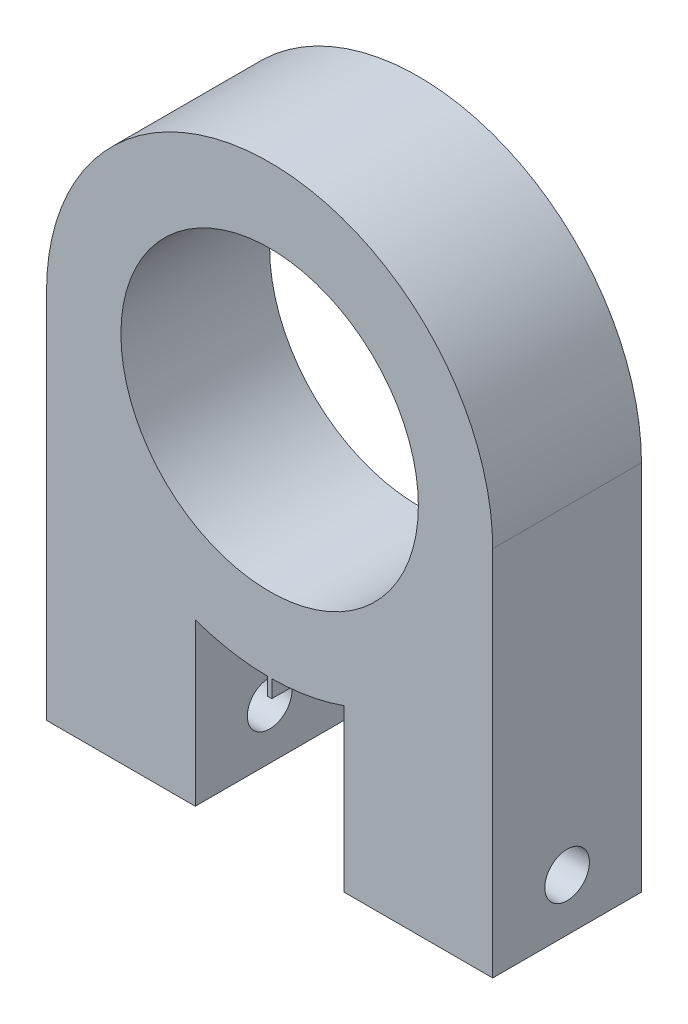
ISO-10303-21;
HEADER;
FILE_DESCRIPTION(('STEP AP214'),'2;1');
FILE_NAME('part.step','',(''),(''),'','','');
FILE_SCHEMA(('AUTOMOTIVE_DESIGN { 1 0 10303 214 1 1 1 1 }'));
ENDSEC;
DATA;
#1=APPLICATION_CONTEXT('core data for automotive mechanical design processes');
#2=APPLICATION_PROTOCOL_DEFINITION('international standard','automotive_design',2000,#1);
#3=PRODUCT_CONTEXT('',#1,'mechanical');
#4=PRODUCT('Part','Part','',(#3));
#5=PRODUCT_RELATED_PRODUCT_CATEGORY('part','',(#4));
#6=PRODUCT_DEFINITION_FORMATION('','',#4);
#7=PRODUCT_DEFINITION_CONTEXT('part definition',#1,'design');
#8=PRODUCT_DEFINITION('design','',#6,#7);
#9=PRODUCT_DEFINITION_SHAPE('','',#8);
#10=(LENGTH_UNIT() NAMED_UNIT(*) SI_UNIT(.MILLI.,.METRE.));
#11=(NAMED_UNIT(*) PLANE_ANGLE_UNIT() SI_UNIT($,.RADIAN.));
#12=(NAMED_UNIT(*) SI_UNIT($,.STERADIAN.) SOLID_ANGLE_UNIT());
#13=UNCERTAINTY_MEASURE_WITH_UNIT(LENGTH_MEASURE(1.E-05),#10,'distance_accuracy_value','');
#14=(GEOMETRIC_REPRESENTATION_CONTEXT(3) GLOBAL_UNCERTAINTY_ASSIGNED_CONTEXT((#13)) GLOBAL_UNIT_ASSIGNED_CONTEXT((#10,
#11,#12)) REPRESENTATION_CONTEXT('',''));
#15=CARTESIAN_POINT('',(0.,0.,0.));
#16=DIRECTION('',(0.,0.,1.));
#17=DIRECTION('',(1.,0.,0.));
#18=AXIS2_PLACEMENT_3D('',#15,#16,#17);
#19=CARTESIAN_POINT('',(0.,0.,10.));
#20=DIRECTION('',(0.,0.,-1.));
#21=DIRECTION('',(-1.,0.,0.));
#22=AXIS2_PLACEMENT_3D('',#19,#20,#21);
#23=CYLINDRICAL_SURFACE('',#22,15.);
#24=CARTESIAN_POINT('',(0.,0.,10.));
#25=DIRECTION('',(0.,0.,1.));
#26=DIRECTION('',(1.,0.,0.));
#27=AXIS2_PLACEMENT_3D('',#24,#25,#26);
#28=CIRCLE('',#27,15.);
#29=CARTESIAN_POINT('',(0.142379023529695,-14.9993242585677,10.));
#30=VERTEX_POINT('',#29);
#31=CARTESIAN_POINT('',(5.00000000000001,-14.1421356237309,10.));
#32=VERTEX_POINT('',#31);
#33=EDGE_CURVE('E253',#30,#32,#28,.T.);
#34=ORIENTED_EDGE('',*,*,#33,.F.);
#35=DIRECTION('',(0.,0.,-1.));
#36=VECTOR('',#35,1.);
#37=CARTESIAN_POINT('',(0.142379023529695,-14.9993242585677,10.));
#38=LINE('',#37,#36);
#39=CARTESIAN_POINT('',(0.142379023529695,-14.9993242585677,0.));
#40=VERTEX_POINT('',#39);
#41=EDGE_CURVE('E11',#30,#40,#38,.T.);
#42=ORIENTED_EDGE('',*,*,#41,.T.);
#43=CARTESIAN_POINT('',(0.,0.,0.));
#44=DIRECTION('',(0.,0.,1.));
#45=DIRECTION('',(1.,0.,0.));
#46=AXIS2_PLACEMENT_3D('',#43,#44,#45);
#47=CIRCLE('',#46,15.);
#48=CARTESIAN_POINT('',(5.00000000000001,-14.1421356237309,0.));
#49=VERTEX_POINT('',#48);
#50=EDGE_CURVE('E244',#40,#49,#47,.T.);
#51=ORIENTED_EDGE('',*,*,#50,.T.);
#52=DIRECTION('',(0.,0.,-1.));
#53=VECTOR('',#52,1.);
#54=CARTESIAN_POINT('',(5.00000000000001,-14.1421356237309,10.));
#55=LINE('',#54,#53);
#56=EDGE_CURVE('E229',#49,#32,#55,.F.);
#57=ORIENTED_EDGE('',*,*,#56,.T.);
#58=EDGE_LOOP('',(#34,#42,#51,#57));
#59=FACE_BOUND('',#58,.T.);
#60=ADVANCED_FACE('F39',(#59),#23,.T.);
#61=CARTESIAN_POINT('',(15.,0.,0.));
#62=VERTEX_POINT('',#61);
#63=CARTESIAN_POINT('',(-15.,0.,0.));
#64=VERTEX_POINT('',#63);
#65=EDGE_CURVE('E254',#62,#64,#47,.T.);
#66=ORIENTED_EDGE('',*,*,#65,.T.);
#67=DIRECTION('',(0.,0.,1.));
#68=VECTOR('',#67,1.);
#69=CARTESIAN_POINT('',(-15.,0.,0.));
#70=LINE('',#69,#68);
#71=CARTESIAN_POINT('',(-15.,0.,10.));
#72=VERTEX_POINT('',#71);
#73=EDGE_CURVE('E191',#64,#72,#70,.T.);
#74=ORIENTED_EDGE('',*,*,#73,.T.);
#75=CARTESIAN_POINT('',(15.,0.,10.));
#76=VERTEX_POINT('',#75);
#77=EDGE_CURVE('E248',#76,#72,#28,.T.);
#78=ORIENTED_EDGE('',*,*,#77,.F.);
#79=DIRECTION('',(0.,0.,1.));
#80=VECTOR('',#79,1.);
#81=CARTESIAN_POINT('',(15.,0.,0.));
#82=LINE('',#81,#80);
#83=EDGE_CURVE('E225',#62,#76,#82,.T.);
#84=ORIENTED_EDGE('',*,*,#83,.F.);
#85=EDGE_LOOP('',(#66,#74,#78,#84));
#86=FACE_BOUND('',#85,.T.);
#87=ADVANCED_FACE('F287',(#86),#23,.T.);
#88=CARTESIAN_POINT('',(0.,0.,10.));
#89=DIRECTION('',(0.,0.,1.));
#90=DIRECTION('',(1.,0.,0.));
#91=AXIS2_PLACEMENT_3D('',#88,#89,#90);
#92=PLANE('',#91);
#93=CARTESIAN_POINT('',(-5.,-14.142135623731,10.));
#94=VERTEX_POINT('',#93);
#95=CARTESIAN_POINT('',(-0.142379023529686,-14.9993242585677,10.));
#96=VERTEX_POINT('',#95);
#97=EDGE_CURVE('E252',#94,#96,#28,.T.);
#98=ORIENTED_EDGE('',*,*,#97,.T.);
#99=DIRECTION('',(0.,-1.,0.));
#100=VECTOR('',#99,1.);
#101=CARTESIAN_POINT('',(-0.142379023529686,-14.6382434881118,10.));
#102=LINE('',#101,#100);
#103=CARTESIAN_POINT('',(-0.142379023529686,-16.1643789896136,10.));
#104=VERTEX_POINT('',#103);
#105=EDGE_CURVE('E162',#96,#104,#102,.T.);
#106=ORIENTED_EDGE('',*,*,#105,.T.);
#107=DIRECTION('',(1.,0.,0.));
#108=VECTOR('',#107,1.);
#109=CARTESIAN_POINT('',(0.142379023529695,-16.1643789896136,10.));
#110=LINE('',#109,#108);
#111=CARTESIAN_POINT('',(0.142379023529695,-16.1643789896136,10.));
#112=VERTEX_POINT('',#111);
#113=EDGE_CURVE('E148',#104,#112,#110,.T.);
#114=ORIENTED_EDGE('',*,*,#113,.T.);
#115=DIRECTION('',(0.,1.,0.));
#116=VECTOR('',#115,1.);
#117=CARTESIAN_POINT('',(0.142379023529695,-14.6382434881118,10.));
#118=LINE('',#117,#116);
#119=EDGE_CURVE('E55',#112,#30,#118,.T.);
#120=ORIENTED_EDGE('',*,*,#119,.T.);
#121=ORIENTED_EDGE('',*,*,#33,.T.);
#122=DIRECTION('',(0.,-1.,0.));
#123=VECTOR('',#122,1.);
#124=CARTESIAN_POINT('',(5.00000000000001,-8.66025403784439,10.));
#125=LINE('',#124,#123);
#126=CARTESIAN_POINT('',(5.,-25.,10.));
#127=VERTEX_POINT('',#126);
#128=EDGE_CURVE('E204',#32,#127,#125,.T.);
#129=ORIENTED_EDGE('',*,*,#128,.T.);
#130=DIRECTION('',(1.,0.,0.));
#131=VECTOR('',#130,1.);
#132=CARTESIAN_POINT('',(5.,-25.,10.));
#133=LINE('',#132,#131);
#134=CARTESIAN_POINT('',(15.,-25.,10.));
#135=VERTEX_POINT('',#134);
#136=EDGE_CURVE('E219',#127,#135,#133,.T.);
#137=ORIENTED_EDGE('',*,*,#136,.T.);
#138=DIRECTION('',(0.,1.,0.));
#139=VECTOR('',#138,1.);
#140=CARTESIAN_POINT('',(15.,0.,10.));
#141=LINE('',#140,#139);
#142=EDGE_CURVE('E209',#135,#76,#141,.T.);
#143=ORIENTED_EDGE('',*,*,#142,.T.);
#144=ORIENTED_EDGE('',*,*,#77,.T.);
#145=DIRECTION('',(0.,-1.,0.));
#146=VECTOR('',#145,1.);
#147=CARTESIAN_POINT('',(-15.,0.,10.));
#148=LINE('',#147,#146);
#149=CARTESIAN_POINT('',(-15.,-25.,10.));
#150=VERTEX_POINT('',#149);
#151=EDGE_CURVE('E169',#72,#150,#148,.T.);
#152=ORIENTED_EDGE('',*,*,#151,.T.);
#153=DIRECTION('',(1.,0.,0.));
#154=VECTOR('',#153,1.);
#155=CARTESIAN_POINT('',(-5.,-25.,10.));
#156=LINE('',#155,#154);
#157=CARTESIAN_POINT('',(-5.,-25.,10.));
#158=VERTEX_POINT('',#157);
#159=EDGE_CURVE('E186',#150,#158,#156,.T.);
#160=ORIENTED_EDGE('',*,*,#159,.T.);
#161=DIRECTION('',(0.,1.,0.));
#162=VECTOR('',#161,1.);
#163=CARTESIAN_POINT('',(-5.,-8.66025403784439,10.));
#164=LINE('',#163,#162);
#165=EDGE_CURVE('E62',#158,#94,#164,.T.);
#166=ORIENTED_EDGE('',*,*,#165,.T.);
#167=EDGE_LOOP('',(#98,#106,#114,#120,#121,#129,#137,#143,#144,#152,#160,#166));
#168=FACE_BOUND('',#167,.T.);
#169=CARTESIAN_POINT('',(0.,0.,10.));
#170=DIRECTION('',(0.,0.,1.));
#171=DIRECTION('',(1.,0.,0.));
#172=AXIS2_PLACEMENT_3D('',#169,#170,#171);
#173=CIRCLE('',#172,10.);
#174=CARTESIAN_POINT('',(10.,0.,10.));
#175=VERTEX_POINT('',#174);
#176=EDGE_CURVE('E240',#175,#175,#173,.T.);
#177=ORIENTED_EDGE('',*,*,#176,.F.);
#178=EDGE_LOOP('',(#177));
#179=FACE_BOUND('',#178,.T.);
#180=ADVANCED_FACE('F261',(#168,#179),#92,.T.);
#181=CARTESIAN_POINT('',(0.,0.,0.));
#182=DIRECTION('',(0.,0.,1.));
#183=DIRECTION('',(1.,0.,0.));
#184=AXIS2_PLACEMENT_3D('',#181,#182,#183);
#185=PLANE('',#184);
#186=DIRECTION('',(0.,-1.,0.));
#187=VECTOR('',#186,1.);
#188=CARTESIAN_POINT('',(-0.142379023529686,-14.6382434881118,0.));
#189=LINE('',#188,#187);
#190=CARTESIAN_POINT('',(-0.142379023529686,-14.9993242585677,0.));
#191=VERTEX_POINT('',#190);
#192=CARTESIAN_POINT('',(-0.142379023529686,-16.1643789896136,0.));
#193=VERTEX_POINT('',#192);
#194=EDGE_CURVE('E131',#191,#193,#189,.T.);
#195=ORIENTED_EDGE('',*,*,#194,.F.);
#196=CARTESIAN_POINT('',(-5.,-14.142135623731,0.));
#197=VERTEX_POINT('',#196);
#198=EDGE_CURVE('E257',#197,#191,#47,.T.);
#199=ORIENTED_EDGE('',*,*,#198,.F.);
#200=DIRECTION('',(0.,1.,0.));
#201=VECTOR('',#200,1.);
#202=CARTESIAN_POINT('',(-5.,-8.66025403784439,0.));
#203=LINE('',#202,#201);
#204=CARTESIAN_POINT('',(-5.,-25.,0.));
#205=VERTEX_POINT('',#204);
#206=EDGE_CURVE('E179',#205,#197,#203,.T.);
#207=ORIENTED_EDGE('',*,*,#206,.F.);
#208=DIRECTION('',(1.,0.,0.));
#209=VECTOR('',#208,1.);
#210=CARTESIAN_POINT('',(-5.,-25.,0.));
#211=LINE('',#210,#209);
#212=CARTESIAN_POINT('',(-15.,-25.,0.));
#213=VERTEX_POINT('',#212);
#214=EDGE_CURVE('E175',#213,#205,#211,.T.);
#215=ORIENTED_EDGE('',*,*,#214,.F.);
#216=DIRECTION('',(0.,-1.,0.));
#217=VECTOR('',#216,1.);
#218=CARTESIAN_POINT('',(-15.,0.,0.));
#219=LINE('',#218,#217);
#220=EDGE_CURVE('E171',#64,#213,#219,.T.);
#221=ORIENTED_EDGE('',*,*,#220,.F.);
#222=ORIENTED_EDGE('',*,*,#65,.F.);
#223=DIRECTION('',(0.,1.,0.));
#224=VECTOR('',#223,1.);
#225=CARTESIAN_POINT('',(15.,0.,0.));
#226=LINE('',#225,#224);
#227=CARTESIAN_POINT('',(15.,-25.,0.));
#228=VERTEX_POINT('',#227);
#229=EDGE_CURVE('E213',#228,#62,#226,.T.);
#230=ORIENTED_EDGE('',*,*,#229,.F.);
#231=DIRECTION('',(1.,0.,0.));
#232=VECTOR('',#231,1.);
#233=CARTESIAN_POINT('',(5.,-25.,0.));
#234=LINE('',#233,#232);
#235=CARTESIAN_POINT('',(5.,-25.,0.));
#236=VERTEX_POINT('',#235);
#237=EDGE_CURVE('E208',#236,#228,#234,.T.);
#238=ORIENTED_EDGE('',*,*,#237,.F.);
#239=DIRECTION('',(0.,-1.,0.));
#240=VECTOR('',#239,1.);
#241=CARTESIAN_POINT('',(5.00000000000001,-8.66025403784439,0.));
#242=LINE('',#241,#240);
#243=EDGE_CURVE('E205',#49,#236,#242,.T.);
#244=ORIENTED_EDGE('',*,*,#243,.F.);
#245=ORIENTED_EDGE('',*,*,#50,.F.);
#246=DIRECTION('',(0.,1.,0.));
#247=VECTOR('',#246,1.);
#248=CARTESIAN_POINT('',(0.142379023529695,-14.6382434881118,0.));
#249=LINE('',#248,#247);
#250=CARTESIAN_POINT('',(0.142379023529695,-16.1643789896136,0.));
#251=VERTEX_POINT('',#250);
#252=EDGE_CURVE('E143',#251,#40,#249,.T.);
#253=ORIENTED_EDGE('',*,*,#252,.F.);
#254=DIRECTION('',(1.,0.,0.));
#255=VECTOR('',#254,1.);
#256=CARTESIAN_POINT('',(0.142379023529695,-16.1643789896136,0.));
#257=LINE('',#256,#255);
#258=EDGE_CURVE('E142',#193,#251,#257,.T.);
#259=ORIENTED_EDGE('',*,*,#258,.F.);
#260=EDGE_LOOP('',(#195,#199,#207,#215,#221,#222,#230,#238,#244,#245,#253,#259));
#261=FACE_BOUND('',#260,.T.);
#262=CARTESIAN_POINT('',(0.,0.,0.));
#263=DIRECTION('',(0.,0.,1.));
#264=DIRECTION('',(1.,0.,0.));
#265=AXIS2_PLACEMENT_3D('',#262,#263,#264);
#266=CIRCLE('',#265,10.);
#267=CARTESIAN_POINT('',(10.,0.,0.));
#268=VERTEX_POINT('',#267);
#269=EDGE_CURVE('E239',#268,#268,#266,.T.);
#270=ORIENTED_EDGE('',*,*,#269,.T.);
#271=EDGE_LOOP('',(#270));
#272=FACE_BOUND('',#271,.T.);
#273=ADVANCED_FACE('F153',(#261,#272),#185,.F.);
#274=ORIENTED_EDGE('',*,*,#198,.T.);
#275=DIRECTION('',(0.,0.,-1.));
#276=VECTOR('',#275,1.);
#277=CARTESIAN_POINT('',(-0.142379023529686,-14.9993242585677,10.));
#278=LINE('',#277,#276);
#279=EDGE_CURVE('E48',#191,#96,#278,.F.);
#280=ORIENTED_EDGE('',*,*,#279,.T.);
#281=ORIENTED_EDGE('',*,*,#97,.F.);
#282=DIRECTION('',(0.,0.,-1.));
#283=VECTOR('',#282,1.);
#284=CARTESIAN_POINT('',(-5.,-14.142135623731,10.));
#285=LINE('',#284,#283);
#286=EDGE_CURVE('E195',#94,#197,#285,.T.);
#287=ORIENTED_EDGE('',*,*,#286,.T.);
#288=EDGE_LOOP('',(#274,#280,#281,#287));
#289=FACE_BOUND('',#288,.T.);
#290=ADVANCED_FACE('F41',(#289),#23,.T.);
#291=CARTESIAN_POINT('',(0.,0.,10.));
#292=DIRECTION('',(0.,0.,-1.));
#293=DIRECTION('',(-1.,0.,0.));
#294=AXIS2_PLACEMENT_3D('',#291,#292,#293);
#295=CYLINDRICAL_SURFACE('',#294,10.);
#296=ORIENTED_EDGE('',*,*,#176,.T.);
#297=EDGE_LOOP('',(#296));
#298=FACE_BOUND('',#297,.T.);
#299=ORIENTED_EDGE('',*,*,#269,.F.);
#300=EDGE_LOOP('',(#299));
#301=FACE_BOUND('',#300,.T.);
#302=ADVANCED_FACE('F316',(#298,#301),#295,.F.);
#303=CARTESIAN_POINT('',(5.00000000000001,-8.66025403784439,0.));
#304=DIRECTION('',(-1.,0.,0.));
#305=DIRECTION('',(0.,-1.,0.));
#306=AXIS2_PLACEMENT_3D('',#303,#304,#305);
#307=PLANE('',#306);
#308=CARTESIAN_POINT('',(5.00000000000001,-21.5,5.));
#309=DIRECTION('',(-1.,0.,0.));
#310=DIRECTION('',(0.,-1.,0.));
#311=AXIS2_PLACEMENT_3D('',#308,#309,#310);
#312=CIRCLE('',#311,1.5);
#313=CARTESIAN_POINT('',(5.00000000000001,-23.,5.));
#314=VERTEX_POINT('',#313);
#315=EDGE_CURVE('E163',#314,#314,#312,.T.);
#316=ORIENTED_EDGE('',*,*,#315,.F.);
#317=EDGE_LOOP('',(#316));
#318=FACE_BOUND('',#317,.T.);
#319=ORIENTED_EDGE('',*,*,#56,.F.);
#320=ORIENTED_EDGE('',*,*,#243,.T.);
#321=DIRECTION('',(0.,0.,1.));
#322=VECTOR('',#321,1.);
#323=CARTESIAN_POINT('',(5.,-25.,0.));
#324=LINE('',#323,#322);
#325=EDGE_CURVE('E216',#236,#127,#324,.T.);
#326=ORIENTED_EDGE('',*,*,#325,.T.);
#327=ORIENTED_EDGE('',*,*,#128,.F.);
#328=EDGE_LOOP('',(#319,#320,#326,#327));
#329=FACE_BOUND('',#328,.T.);
#330=ADVANCED_FACE('F270',(#318,#329),#307,.T.);
#331=CARTESIAN_POINT('',(15.,0.,0.));
#332=DIRECTION('',(1.,0.,0.));
#333=DIRECTION('',(0.,1.,0.));
#334=AXIS2_PLACEMENT_3D('',#331,#332,#333);
#335=PLANE('',#334);
#336=CARTESIAN_POINT('',(15.,-21.5,5.));
#337=DIRECTION('',(-1.,0.,0.));
#338=DIRECTION('',(0.,-1.,0.));
#339=AXIS2_PLACEMENT_3D('',#336,#337,#338);
#340=CIRCLE('',#339,1.5);
#341=CARTESIAN_POINT('',(15.,-23.,5.));
#342=VERTEX_POINT('',#341);
#343=EDGE_CURVE('E361',#342,#342,#340,.T.);
#344=ORIENTED_EDGE('',*,*,#343,.T.);
#345=EDGE_LOOP('',(#344));
#346=FACE_BOUND('',#345,.T.);
#347=ORIENTED_EDGE('',*,*,#142,.F.);
#348=DIRECTION('',(0.,0.,1.));
#349=VECTOR('',#348,1.);
#350=CARTESIAN_POINT('',(15.,-25.,0.));
#351=LINE('',#350,#349);
#352=EDGE_CURVE('E230',#228,#135,#351,.T.);
#353=ORIENTED_EDGE('',*,*,#352,.F.);
#354=ORIENTED_EDGE('',*,*,#229,.T.);
#355=ORIENTED_EDGE('',*,*,#83,.T.);
#356=EDGE_LOOP('',(#347,#353,#354,#355));
#357=FACE_BOUND('',#356,.T.);
#358=ADVANCED_FACE('F284',(#346,#357),#335,.T.);
#359=CARTESIAN_POINT('',(5.,-25.,0.));
#360=DIRECTION('',(0.,-1.,0.));
#361=DIRECTION('',(0.,0.,-1.));
#362=AXIS2_PLACEMENT_3D('',#359,#360,#361);
#363=PLANE('',#362);
#364=ORIENTED_EDGE('',*,*,#136,.F.);
#365=ORIENTED_EDGE('',*,*,#325,.F.);
#366=ORIENTED_EDGE('',*,*,#237,.T.);
#367=ORIENTED_EDGE('',*,*,#352,.T.);
#368=EDGE_LOOP('',(#364,#365,#366,#367));
#369=FACE_BOUND('',#368,.T.);
#370=ADVANCED_FACE('F279',(#369),#363,.T.);
#371=CARTESIAN_POINT('',(-5.,-8.66025403784439,0.));
#372=DIRECTION('',(1.,0.,0.));
#373=DIRECTION('',(0.,1.,0.));
#374=AXIS2_PLACEMENT_3D('',#371,#372,#373);
#375=PLANE('',#374);
#376=CARTESIAN_POINT('',(-4.99999999999999,-21.5,5.));
#377=DIRECTION('',(1.,0.,0.));
#378=DIRECTION('',(0.,1.,0.));
#379=AXIS2_PLACEMENT_3D('',#376,#377,#378);
#380=CIRCLE('',#379,1.5);
#381=CARTESIAN_POINT('',(-4.99999999999999,-20.,5.));
#382=VERTEX_POINT('',#381);
#383=EDGE_CURVE('E356',#382,#382,#380,.T.);
#384=ORIENTED_EDGE('',*,*,#383,.F.);
#385=EDGE_LOOP('',(#384));
#386=FACE_BOUND('',#385,.T.);
#387=ORIENTED_EDGE('',*,*,#286,.F.);
#388=ORIENTED_EDGE('',*,*,#165,.F.);
#389=DIRECTION('',(0.,0.,1.));
#390=VECTOR('',#389,1.);
#391=CARTESIAN_POINT('',(-5.,-25.,0.));
#392=LINE('',#391,#390);
#393=EDGE_CURVE('E196',#205,#158,#392,.T.);
#394=ORIENTED_EDGE('',*,*,#393,.F.);
#395=ORIENTED_EDGE('',*,*,#206,.T.);
#396=EDGE_LOOP('',(#387,#388,#394,#395));
#397=FACE_BOUND('',#396,.T.);
#398=ADVANCED_FACE('F297',(#386,#397),#375,.T.);
#399=CARTESIAN_POINT('',(-15.,0.,0.));
#400=DIRECTION('',(-1.,0.,0.));
#401=DIRECTION('',(0.,-1.,0.));
#402=AXIS2_PLACEMENT_3D('',#399,#400,#401);
#403=PLANE('',#402);
#404=CARTESIAN_POINT('',(-15.,-21.5,5.));
#405=DIRECTION('',(-1.,0.,0.));
#406=DIRECTION('',(0.,-1.,0.));
#407=AXIS2_PLACEMENT_3D('',#404,#405,#406);
#408=CIRCLE('',#407,1.5);
#409=CARTESIAN_POINT('',(-15.,-23.,5.));
#410=VERTEX_POINT('',#409);
#411=EDGE_CURVE('E359',#410,#410,#408,.T.);
#412=ORIENTED_EDGE('',*,*,#411,.F.);
#413=EDGE_LOOP('',(#412));
#414=FACE_BOUND('',#413,.T.);
#415=ORIENTED_EDGE('',*,*,#151,.F.);
#416=ORIENTED_EDGE('',*,*,#73,.F.);
#417=ORIENTED_EDGE('',*,*,#220,.T.);
#418=DIRECTION('',(0.,0.,1.));
#419=VECTOR('',#418,1.);
#420=CARTESIAN_POINT('',(-15.,-25.,0.));
#421=LINE('',#420,#419);
#422=EDGE_CURVE('E182',#213,#150,#421,.T.);
#423=ORIENTED_EDGE('',*,*,#422,.T.);
#424=EDGE_LOOP('',(#415,#416,#417,#423));
#425=FACE_BOUND('',#424,.T.);
#426=ADVANCED_FACE('F290',(#414,#425),#403,.T.);
#427=CARTESIAN_POINT('',(-5.,-25.,0.));
#428=DIRECTION('',(0.,-1.,0.));
#429=DIRECTION('',(0.,0.,-1.));
#430=AXIS2_PLACEMENT_3D('',#427,#428,#429);
#431=PLANE('',#430);
#432=ORIENTED_EDGE('',*,*,#159,.F.);
#433=ORIENTED_EDGE('',*,*,#422,.F.);
#434=ORIENTED_EDGE('',*,*,#214,.T.);
#435=ORIENTED_EDGE('',*,*,#393,.T.);
#436=EDGE_LOOP('',(#432,#433,#434,#435));
#437=FACE_BOUND('',#436,.T.);
#438=ADVANCED_FACE('F295',(#437),#431,.T.);
#439=CARTESIAN_POINT('',(0.142379023529695,-14.6382434881118,0.));
#440=DIRECTION('',(1.,0.,0.));
#441=DIRECTION('',(0.,0.,-1.));
#442=AXIS2_PLACEMENT_3D('',#439,#440,#441);
#443=PLANE('',#442);
#444=ORIENTED_EDGE('',*,*,#41,.F.);
#445=ORIENTED_EDGE('',*,*,#119,.F.);
#446=DIRECTION('',(0.,0.,1.));
#447=VECTOR('',#446,1.);
#448=CARTESIAN_POINT('',(0.142379023529695,-16.1643789896136,0.));
#449=LINE('',#448,#447);
#450=EDGE_CURVE('E150',#251,#112,#449,.T.);
#451=ORIENTED_EDGE('',*,*,#450,.F.);
#452=ORIENTED_EDGE('',*,*,#252,.T.);
#453=EDGE_LOOP('',(#444,#445,#451,#452));
#454=FACE_BOUND('',#453,.T.);
#455=ADVANCED_FACE('F334',(#454),#443,.T.);
#456=CARTESIAN_POINT('',(-0.142379023529686,-14.6382434881118,0.));
#457=DIRECTION('',(-1.,0.,0.));
#458=DIRECTION('',(0.,0.,1.));
#459=AXIS2_PLACEMENT_3D('',#456,#457,#458);
#460=PLANE('',#459);
#461=ORIENTED_EDGE('',*,*,#279,.F.);
#462=ORIENTED_EDGE('',*,*,#194,.T.);
#463=DIRECTION('',(0.,0.,1.));
#464=VECTOR('',#463,1.);
#465=CARTESIAN_POINT('',(-0.142379023529686,-16.1643789896136,0.));
#466=LINE('',#465,#464);
#467=EDGE_CURVE('E134',#193,#104,#466,.T.);
#468=ORIENTED_EDGE('',*,*,#467,.T.);
#469=ORIENTED_EDGE('',*,*,#105,.F.);
#470=EDGE_LOOP('',(#461,#462,#468,#469));
#471=FACE_BOUND('',#470,.T.);
#472=ADVANCED_FACE('F133',(#471),#460,.T.);
#473=CARTESIAN_POINT('',(0.142379023529695,-16.1643789896136,0.));
#474=DIRECTION('',(0.,-1.,0.));
#475=DIRECTION('',(0.,0.,-1.));
#476=AXIS2_PLACEMENT_3D('',#473,#474,#475);
#477=PLANE('',#476);
#478=ORIENTED_EDGE('',*,*,#113,.F.);
#479=ORIENTED_EDGE('',*,*,#467,.F.);
#480=ORIENTED_EDGE('',*,*,#258,.T.);
#481=ORIENTED_EDGE('',*,*,#450,.T.);
#482=EDGE_LOOP('',(#478,#479,#480,#481));
#483=FACE_BOUND('',#482,.T.);
#484=ADVANCED_FACE('F147',(#483),#477,.T.);
#485=CARTESIAN_POINT('',(15.,-21.5,5.));
#486=DIRECTION('',(-1.,0.,0.));
#487=DIRECTION('',(0.,-1.,0.));
#488=AXIS2_PLACEMENT_3D('',#485,#486,#487);
#489=CYLINDRICAL_SURFACE('',#488,1.5);
#490=ORIENTED_EDGE('',*,*,#383,.T.);
#491=EDGE_LOOP('',(#490));
#492=FACE_BOUND('',#491,.T.);
#493=ORIENTED_EDGE('',*,*,#411,.T.);
#494=EDGE_LOOP('',(#493));
#495=FACE_BOUND('',#494,.T.);
#496=ADVANCED_FACE('F346',(#492,#495),#489,.F.);
#497=ORIENTED_EDGE('',*,*,#315,.T.);
#498=EDGE_LOOP('',(#497));
#499=FACE_BOUND('',#498,.T.);
#500=ORIENTED_EDGE('',*,*,#343,.F.);
#501=EDGE_LOOP('',(#500));
#502=FACE_BOUND('',#501,.T.);
#503=ADVANCED_FACE('F348',(#499,#502),#489,.F.);
#504=CLOSED_SHELL('',(#60,#87,#180,#273,#290,#302,#330,#358,#370,#398,#426,#438,#455,#472,#484,
#496,#503));
#505=MANIFOLD_SOLID_BREP('B2',#504);
#506=ADVANCED_BREP_SHAPE_REPRESENTATION('',(#18,#505),#14);
#507=SHAPE_DEFINITION_REPRESENTATION(#9,#506);
ENDSEC;
END-ISO-10303-21;
